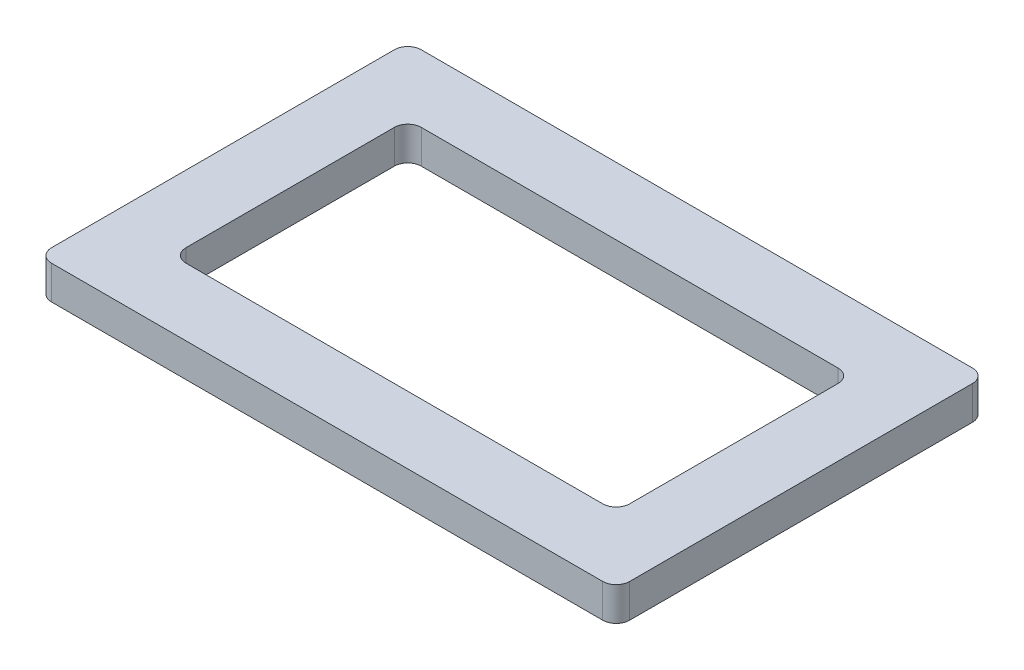
ISO-10303-21;
HEADER;
FILE_DESCRIPTION(('STEP AP214'),'2;1');
FILE_NAME('part.step','',(''),(''),'','','');
FILE_SCHEMA(('AUTOMOTIVE_DESIGN { 1 0 10303 214 1 1 1 1 }'));
ENDSEC;
DATA;
#1=APPLICATION_CONTEXT('core data for automotive mechanical design processes');
#2=APPLICATION_PROTOCOL_DEFINITION('international standard','automotive_design',2000,#1);
#3=PRODUCT_CONTEXT('',#1,'mechanical');
#4=PRODUCT('Part','Part','',(#3));
#5=PRODUCT_RELATED_PRODUCT_CATEGORY('part','',(#4));
#6=PRODUCT_DEFINITION_FORMATION('','',#4);
#7=PRODUCT_DEFINITION_CONTEXT('part definition',#1,'design');
#8=PRODUCT_DEFINITION('design','',#6,#7);
#9=PRODUCT_DEFINITION_SHAPE('','',#8);
#10=(LENGTH_UNIT() NAMED_UNIT(*) SI_UNIT(.MILLI.,.METRE.));
#11=(NAMED_UNIT(*) PLANE_ANGLE_UNIT() SI_UNIT($,.RADIAN.));
#12=(NAMED_UNIT(*) SI_UNIT($,.STERADIAN.) SOLID_ANGLE_UNIT());
#13=UNCERTAINTY_MEASURE_WITH_UNIT(LENGTH_MEASURE(1.E-05),#10,'distance_accuracy_value','');
#14=(GEOMETRIC_REPRESENTATION_CONTEXT(3) GLOBAL_UNCERTAINTY_ASSIGNED_CONTEXT((#13)) GLOBAL_UNIT_ASSIGNED_CONTEXT((#10,
#11,#12)) REPRESENTATION_CONTEXT('',''));
#15=CARTESIAN_POINT('',(0.,0.,0.));
#16=DIRECTION('',(0.,0.,1.));
#17=DIRECTION('',(1.,0.,0.));
#18=AXIS2_PLACEMENT_3D('',#15,#16,#17);
#19=CARTESIAN_POINT('',(43.,5.,27.5));
#20=DIRECTION('',(-1.,0.,0.));
#21=DIRECTION('',(0.,0.,1.));
#22=AXIS2_PLACEMENT_3D('',#19,#20,#21);
#23=PLANE('',#22);
#24=DIRECTION('',(0.,0.,-1.));
#25=VECTOR('',#24,1.);
#26=CARTESIAN_POINT('',(43.,0.,27.5));
#27=LINE('',#26,#25);
#28=CARTESIAN_POINT('',(43.,0.,25.5));
#29=VERTEX_POINT('',#28);
#30=CARTESIAN_POINT('',(43.,0.,-25.5));
#31=VERTEX_POINT('',#30);
#32=EDGE_CURVE('E197',#29,#31,#27,.T.);
#33=ORIENTED_EDGE('',*,*,#32,.T.);
#34=DIRECTION('',(0.,-1.,0.));
#35=VECTOR('',#34,1.);
#36=CARTESIAN_POINT('',(43.,5.,-25.5));
#37=LINE('',#36,#35);
#38=CARTESIAN_POINT('',(43.,5.,-25.5));
#39=VERTEX_POINT('',#38);
#40=EDGE_CURVE('E237',#31,#39,#37,.F.);
#41=ORIENTED_EDGE('',*,*,#40,.T.);
#42=DIRECTION('',(0.,0.,-1.));
#43=VECTOR('',#42,1.);
#44=CARTESIAN_POINT('',(43.,5.,27.5));
#45=LINE('',#44,#43);
#46=CARTESIAN_POINT('',(43.,5.,25.5));
#47=VERTEX_POINT('',#46);
#48=EDGE_CURVE('E186',#47,#39,#45,.T.);
#49=ORIENTED_EDGE('',*,*,#48,.F.);
#50=DIRECTION('',(0.,-1.,0.));
#51=VECTOR('',#50,1.);
#52=CARTESIAN_POINT('',(43.,5.,25.5));
#53=LINE('',#52,#51);
#54=EDGE_CURVE('E234',#47,#29,#53,.T.);
#55=ORIENTED_EDGE('',*,*,#54,.T.);
#56=EDGE_LOOP('',(#33,#41,#49,#55));
#57=FACE_BOUND('',#56,.T.);
#58=ADVANCED_FACE('F32',(#57),#23,.F.);
#59=CARTESIAN_POINT('',(-43.,5.,-27.5));
#60=DIRECTION('',(0.,0.,1.));
#61=DIRECTION('',(1.,0.,0.));
#62=AXIS2_PLACEMENT_3D('',#59,#60,#61);
#63=PLANE('',#62);
#64=DIRECTION('',(-1.,0.,0.));
#65=VECTOR('',#64,1.);
#66=CARTESIAN_POINT('',(-43.,5.,-27.5));
#67=LINE('',#66,#65);
#68=CARTESIAN_POINT('',(41.,5.,-27.5));
#69=VERTEX_POINT('',#68);
#70=CARTESIAN_POINT('',(-41.,5.,-27.5));
#71=VERTEX_POINT('',#70);
#72=EDGE_CURVE('E189',#69,#71,#67,.T.);
#73=ORIENTED_EDGE('',*,*,#72,.F.);
#74=DIRECTION('',(0.,-1.,0.));
#75=VECTOR('',#74,1.);
#76=CARTESIAN_POINT('',(41.,5.,-27.5));
#77=LINE('',#76,#75);
#78=CARTESIAN_POINT('',(41.,0.,-27.5));
#79=VERTEX_POINT('',#78);
#80=EDGE_CURVE('E223',#69,#79,#77,.T.);
#81=ORIENTED_EDGE('',*,*,#80,.T.);
#82=DIRECTION('',(-1.,0.,0.));
#83=VECTOR('',#82,1.);
#84=CARTESIAN_POINT('',(-43.,0.,-27.5));
#85=LINE('',#84,#83);
#86=CARTESIAN_POINT('',(-41.,0.,-27.5));
#87=VERTEX_POINT('',#86);
#88=EDGE_CURVE('E200',#79,#87,#85,.T.);
#89=ORIENTED_EDGE('',*,*,#88,.T.);
#90=DIRECTION('',(0.,-1.,0.));
#91=VECTOR('',#90,1.);
#92=CARTESIAN_POINT('',(-41.,5.,-27.5));
#93=LINE('',#92,#91);
#94=EDGE_CURVE('E221',#87,#71,#93,.F.);
#95=ORIENTED_EDGE('',*,*,#94,.T.);
#96=EDGE_LOOP('',(#73,#81,#89,#95));
#97=FACE_BOUND('',#96,.T.);
#98=ADVANCED_FACE('F300',(#97),#63,.F.);
#99=CARTESIAN_POINT('',(-43.,5.,27.5));
#100=DIRECTION('',(1.,0.,0.));
#101=DIRECTION('',(0.,0.,-1.));
#102=AXIS2_PLACEMENT_3D('',#99,#100,#101);
#103=PLANE('',#102);
#104=DIRECTION('',(0.,0.,1.));
#105=VECTOR('',#104,1.);
#106=CARTESIAN_POINT('',(-43.,5.,27.5));
#107=LINE('',#106,#105);
#108=CARTESIAN_POINT('',(-43.,5.,-25.5));
#109=VERTEX_POINT('',#108);
#110=CARTESIAN_POINT('',(-43.,5.,25.5));
#111=VERTEX_POINT('',#110);
#112=EDGE_CURVE('E193',#109,#111,#107,.T.);
#113=ORIENTED_EDGE('',*,*,#112,.F.);
#114=DIRECTION('',(0.,-1.,0.));
#115=VECTOR('',#114,1.);
#116=CARTESIAN_POINT('',(-43.,5.,-25.5));
#117=LINE('',#116,#115);
#118=CARTESIAN_POINT('',(-43.,0.,-25.5));
#119=VERTEX_POINT('',#118);
#120=EDGE_CURVE('E157',#109,#119,#117,.T.);
#121=ORIENTED_EDGE('',*,*,#120,.T.);
#122=DIRECTION('',(0.,0.,1.));
#123=VECTOR('',#122,1.);
#124=CARTESIAN_POINT('',(-43.,0.,27.5));
#125=LINE('',#124,#123);
#126=CARTESIAN_POINT('',(-43.,0.,25.5));
#127=VERTEX_POINT('',#126);
#128=EDGE_CURVE('E203',#119,#127,#125,.T.);
#129=ORIENTED_EDGE('',*,*,#128,.T.);
#130=DIRECTION('',(0.,-1.,0.));
#131=VECTOR('',#130,1.);
#132=CARTESIAN_POINT('',(-43.,5.,25.5));
#133=LINE('',#132,#131);
#134=EDGE_CURVE('E250',#127,#111,#133,.F.);
#135=ORIENTED_EDGE('',*,*,#134,.T.);
#136=EDGE_LOOP('',(#113,#121,#129,#135));
#137=FACE_BOUND('',#136,.T.);
#138=ADVANCED_FACE('F306',(#137),#103,.F.);
#139=CARTESIAN_POINT('',(-43.,5.,27.5));
#140=DIRECTION('',(0.,0.,-1.));
#141=DIRECTION('',(-1.,0.,0.));
#142=AXIS2_PLACEMENT_3D('',#139,#140,#141);
#143=PLANE('',#142);
#144=DIRECTION('',(1.,0.,0.));
#145=VECTOR('',#144,1.);
#146=CARTESIAN_POINT('',(-43.,0.,27.5));
#147=LINE('',#146,#145);
#148=CARTESIAN_POINT('',(-41.,0.,27.5));
#149=VERTEX_POINT('',#148);
#150=CARTESIAN_POINT('',(41.,0.,27.5));
#151=VERTEX_POINT('',#150);
#152=EDGE_CURVE('E190',#149,#151,#147,.T.);
#153=ORIENTED_EDGE('',*,*,#152,.T.);
#154=DIRECTION('',(0.,-1.,0.));
#155=VECTOR('',#154,1.);
#156=CARTESIAN_POINT('',(41.,5.,27.5));
#157=LINE('',#156,#155);
#158=CARTESIAN_POINT('',(41.,5.,27.5));
#159=VERTEX_POINT('',#158);
#160=EDGE_CURVE('E47',#151,#159,#157,.F.);
#161=ORIENTED_EDGE('',*,*,#160,.T.);
#162=DIRECTION('',(1.,0.,0.));
#163=VECTOR('',#162,1.);
#164=CARTESIAN_POINT('',(-43.,5.,27.5));
#165=LINE('',#164,#163);
#166=CARTESIAN_POINT('',(-41.,5.,27.5));
#167=VERTEX_POINT('',#166);
#168=EDGE_CURVE('E195',#167,#159,#165,.T.);
#169=ORIENTED_EDGE('',*,*,#168,.F.);
#170=DIRECTION('',(0.,-1.,0.));
#171=VECTOR('',#170,1.);
#172=CARTESIAN_POINT('',(-41.,5.,27.5));
#173=LINE('',#172,#171);
#174=EDGE_CURVE('E246',#167,#149,#173,.T.);
#175=ORIENTED_EDGE('',*,*,#174,.T.);
#176=EDGE_LOOP('',(#153,#161,#169,#175));
#177=FACE_BOUND('',#176,.T.);
#178=ADVANCED_FACE('F312',(#177),#143,.F.);
#179=CARTESIAN_POINT('',(0.,5.,0.));
#180=DIRECTION('',(0.,-1.,0.));
#181=DIRECTION('',(0.,0.,-1.));
#182=AXIS2_PLACEMENT_3D('',#179,#180,#181);
#183=PLANE('',#182);
#184=DIRECTION('',(-1.,0.,0.));
#185=VECTOR('',#184,1.);
#186=CARTESIAN_POINT('',(-33.,5.,-17.5));
#187=LINE('',#186,#185);
#188=CARTESIAN_POINT('',(31.,5.,-17.5));
#189=VERTEX_POINT('',#188);
#190=CARTESIAN_POINT('',(-31.,5.,-17.5));
#191=VERTEX_POINT('',#190);
#192=EDGE_CURVE('E173',#189,#191,#187,.T.);
#193=ORIENTED_EDGE('',*,*,#192,.F.);
#194=CARTESIAN_POINT('',(31.,5.,-15.5));
#195=DIRECTION('',(0.,-1.,0.));
#196=DIRECTION('',(0.,0.,-1.));
#197=AXIS2_PLACEMENT_3D('',#194,#195,#196);
#198=CIRCLE('',#197,2.);
#199=CARTESIAN_POINT('',(33.,5.,-15.5));
#200=VERTEX_POINT('',#199);
#201=EDGE_CURVE('E172',#189,#200,#198,.T.);
#202=ORIENTED_EDGE('',*,*,#201,.T.);
#203=DIRECTION('',(0.,0.,-1.));
#204=VECTOR('',#203,1.);
#205=CARTESIAN_POINT('',(33.,5.,17.5));
#206=LINE('',#205,#204);
#207=CARTESIAN_POINT('',(33.,5.,15.5));
#208=VERTEX_POINT('',#207);
#209=EDGE_CURVE('E163',#208,#200,#206,.T.);
#210=ORIENTED_EDGE('',*,*,#209,.F.);
#211=CARTESIAN_POINT('',(31.,5.,15.5));
#212=DIRECTION('',(0.,-1.,0.));
#213=DIRECTION('',(0.,0.,-1.));
#214=AXIS2_PLACEMENT_3D('',#211,#212,#213);
#215=CIRCLE('',#214,2.);
#216=CARTESIAN_POINT('',(31.,5.,17.5));
#217=VERTEX_POINT('',#216);
#218=EDGE_CURVE('E146',#208,#217,#215,.T.);
#219=ORIENTED_EDGE('',*,*,#218,.T.);
#220=DIRECTION('',(1.,0.,0.));
#221=VECTOR('',#220,1.);
#222=CARTESIAN_POINT('',(-33.,5.,17.5));
#223=LINE('',#222,#221);
#224=CARTESIAN_POINT('',(-31.,5.,17.5));
#225=VERTEX_POINT('',#224);
#226=EDGE_CURVE('E184',#225,#217,#223,.T.);
#227=ORIENTED_EDGE('',*,*,#226,.F.);
#228=CARTESIAN_POINT('',(-31.,5.,15.5));
#229=DIRECTION('',(0.,-1.,0.));
#230=DIRECTION('',(0.,0.,-1.));
#231=AXIS2_PLACEMENT_3D('',#228,#229,#230);
#232=CIRCLE('',#231,2.);
#233=CARTESIAN_POINT('',(-33.,5.,15.5));
#234=VERTEX_POINT('',#233);
#235=EDGE_CURVE('E258',#225,#234,#232,.T.);
#236=ORIENTED_EDGE('',*,*,#235,.T.);
#237=DIRECTION('',(0.,0.,1.));
#238=VECTOR('',#237,1.);
#239=CARTESIAN_POINT('',(-33.,5.,17.5));
#240=LINE('',#239,#238);
#241=CARTESIAN_POINT('',(-33.,5.,-15.5));
#242=VERTEX_POINT('',#241);
#243=EDGE_CURVE('E176',#242,#234,#240,.T.);
#244=ORIENTED_EDGE('',*,*,#243,.F.);
#245=CARTESIAN_POINT('',(-31.,5.,-15.5));
#246=DIRECTION('',(0.,-1.,0.));
#247=DIRECTION('',(0.,0.,-1.));
#248=AXIS2_PLACEMENT_3D('',#245,#246,#247);
#249=CIRCLE('',#248,2.);
#250=EDGE_CURVE('E40',#242,#191,#249,.T.);
#251=ORIENTED_EDGE('',*,*,#250,.T.);
#252=EDGE_LOOP('',(#193,#202,#210,#219,#227,#236,#244,#251));
#253=FACE_BOUND('',#252,.T.);
#254=ORIENTED_EDGE('',*,*,#48,.T.);
#255=CARTESIAN_POINT('',(41.,5.,-25.5));
#256=DIRECTION('',(0.,-1.,0.));
#257=DIRECTION('',(0.,0.,-1.));
#258=AXIS2_PLACEMENT_3D('',#255,#256,#257);
#259=CIRCLE('',#258,2.);
#260=EDGE_CURVE('E244',#39,#69,#259,.F.);
#261=ORIENTED_EDGE('',*,*,#260,.T.);
#262=ORIENTED_EDGE('',*,*,#72,.T.);
#263=CARTESIAN_POINT('',(-41.,5.,-25.5));
#264=DIRECTION('',(0.,-1.,0.));
#265=DIRECTION('',(0.,0.,-1.));
#266=AXIS2_PLACEMENT_3D('',#263,#264,#265);
#267=CIRCLE('',#266,2.);
#268=EDGE_CURVE('E240',#71,#109,#267,.F.);
#269=ORIENTED_EDGE('',*,*,#268,.T.);
#270=ORIENTED_EDGE('',*,*,#112,.T.);
#271=CARTESIAN_POINT('',(-41.,5.,25.5));
#272=DIRECTION('',(0.,-1.,0.));
#273=DIRECTION('',(0.,0.,-1.));
#274=AXIS2_PLACEMENT_3D('',#271,#272,#273);
#275=CIRCLE('',#274,2.);
#276=EDGE_CURVE('E54',#111,#167,#275,.F.);
#277=ORIENTED_EDGE('',*,*,#276,.T.);
#278=ORIENTED_EDGE('',*,*,#168,.T.);
#279=CARTESIAN_POINT('',(41.,5.,25.5));
#280=DIRECTION('',(0.,-1.,0.));
#281=DIRECTION('',(0.,0.,-1.));
#282=AXIS2_PLACEMENT_3D('',#279,#280,#281);
#283=CIRCLE('',#282,2.);
#284=EDGE_CURVE('E242',#159,#47,#283,.F.);
#285=ORIENTED_EDGE('',*,*,#284,.T.);
#286=EDGE_LOOP('',(#254,#261,#262,#269,#270,#277,#278,#285));
#287=FACE_BOUND('',#286,.T.);
#288=ADVANCED_FACE('F171',(#253,#287),#183,.F.);
#289=CARTESIAN_POINT('',(0.,0.,0.));
#290=DIRECTION('',(0.,-1.,0.));
#291=DIRECTION('',(0.,0.,-1.));
#292=AXIS2_PLACEMENT_3D('',#289,#290,#291);
#293=PLANE('',#292);
#294=DIRECTION('',(1.,0.,0.));
#295=VECTOR('',#294,1.);
#296=CARTESIAN_POINT('',(-33.,0.,17.5));
#297=LINE('',#296,#295);
#298=CARTESIAN_POINT('',(-31.,0.,17.5));
#299=VERTEX_POINT('',#298);
#300=CARTESIAN_POINT('',(31.,0.,17.5));
#301=VERTEX_POINT('',#300);
#302=EDGE_CURVE('E179',#299,#301,#297,.T.);
#303=ORIENTED_EDGE('',*,*,#302,.T.);
#304=CARTESIAN_POINT('',(31.,0.,15.5));
#305=DIRECTION('',(0.,-1.,0.));
#306=DIRECTION('',(0.,0.,-1.));
#307=AXIS2_PLACEMENT_3D('',#304,#305,#306);
#308=CIRCLE('',#307,2.);
#309=CARTESIAN_POINT('',(33.,0.,15.5));
#310=VERTEX_POINT('',#309);
#311=EDGE_CURVE('E156',#301,#310,#308,.F.);
#312=ORIENTED_EDGE('',*,*,#311,.T.);
#313=DIRECTION('',(0.,0.,-1.));
#314=VECTOR('',#313,1.);
#315=CARTESIAN_POINT('',(33.,0.,17.5));
#316=LINE('',#315,#314);
#317=CARTESIAN_POINT('',(33.,0.,-15.5));
#318=VERTEX_POINT('',#317);
#319=EDGE_CURVE('E166',#310,#318,#316,.T.);
#320=ORIENTED_EDGE('',*,*,#319,.T.);
#321=CARTESIAN_POINT('',(31.,0.,-15.5));
#322=DIRECTION('',(0.,-1.,0.));
#323=DIRECTION('',(0.,0.,-1.));
#324=AXIS2_PLACEMENT_3D('',#321,#322,#323);
#325=CIRCLE('',#324,2.);
#326=CARTESIAN_POINT('',(31.,0.,-17.5));
#327=VERTEX_POINT('',#326);
#328=EDGE_CURVE('E256',#318,#327,#325,.F.);
#329=ORIENTED_EDGE('',*,*,#328,.T.);
#330=DIRECTION('',(-1.,0.,0.));
#331=VECTOR('',#330,1.);
#332=CARTESIAN_POINT('',(-33.,0.,-17.5));
#333=LINE('',#332,#331);
#334=CARTESIAN_POINT('',(-31.,0.,-17.5));
#335=VERTEX_POINT('',#334);
#336=EDGE_CURVE('E280',#327,#335,#333,.T.);
#337=ORIENTED_EDGE('',*,*,#336,.T.);
#338=CARTESIAN_POINT('',(-31.,0.,-15.5));
#339=DIRECTION('',(0.,-1.,0.));
#340=DIRECTION('',(0.,0.,-1.));
#341=AXIS2_PLACEMENT_3D('',#338,#339,#340);
#342=CIRCLE('',#341,2.);
#343=CARTESIAN_POINT('',(-33.,0.,-15.5));
#344=VERTEX_POINT('',#343);
#345=EDGE_CURVE('E11',#335,#344,#342,.F.);
#346=ORIENTED_EDGE('',*,*,#345,.T.);
#347=DIRECTION('',(0.,0.,1.));
#348=VECTOR('',#347,1.);
#349=CARTESIAN_POINT('',(-33.,0.,17.5));
#350=LINE('',#349,#348);
#351=CARTESIAN_POINT('',(-33.,0.,15.5));
#352=VERTEX_POINT('',#351);
#353=EDGE_CURVE('E278',#344,#352,#350,.T.);
#354=ORIENTED_EDGE('',*,*,#353,.T.);
#355=CARTESIAN_POINT('',(-31.,0.,15.5));
#356=DIRECTION('',(0.,-1.,0.));
#357=DIRECTION('',(0.,0.,-1.));
#358=AXIS2_PLACEMENT_3D('',#355,#356,#357);
#359=CIRCLE('',#358,2.);
#360=EDGE_CURVE('E260',#352,#299,#359,.F.);
#361=ORIENTED_EDGE('',*,*,#360,.T.);
#362=EDGE_LOOP('',(#303,#312,#320,#329,#337,#346,#354,#361));
#363=FACE_BOUND('',#362,.T.);
#364=ORIENTED_EDGE('',*,*,#88,.F.);
#365=CARTESIAN_POINT('',(41.,0.,-25.5));
#366=DIRECTION('',(0.,-1.,0.));
#367=DIRECTION('',(0.,0.,-1.));
#368=AXIS2_PLACEMENT_3D('',#365,#366,#367);
#369=CIRCLE('',#368,2.);
#370=EDGE_CURVE('E232',#79,#31,#369,.T.);
#371=ORIENTED_EDGE('',*,*,#370,.T.);
#372=ORIENTED_EDGE('',*,*,#32,.F.);
#373=CARTESIAN_POINT('',(41.,0.,25.5));
#374=DIRECTION('',(0.,-1.,0.));
#375=DIRECTION('',(0.,0.,-1.));
#376=AXIS2_PLACEMENT_3D('',#373,#374,#375);
#377=CIRCLE('',#376,2.);
#378=EDGE_CURVE('E230',#29,#151,#377,.T.);
#379=ORIENTED_EDGE('',*,*,#378,.T.);
#380=ORIENTED_EDGE('',*,*,#152,.F.);
#381=CARTESIAN_POINT('',(-41.,0.,25.5));
#382=DIRECTION('',(0.,-1.,0.));
#383=DIRECTION('',(0.,0.,-1.));
#384=AXIS2_PLACEMENT_3D('',#381,#382,#383);
#385=CIRCLE('',#384,2.);
#386=EDGE_CURVE('E226',#149,#127,#385,.T.);
#387=ORIENTED_EDGE('',*,*,#386,.T.);
#388=ORIENTED_EDGE('',*,*,#128,.F.);
#389=CARTESIAN_POINT('',(-41.,0.,-25.5));
#390=DIRECTION('',(0.,-1.,0.));
#391=DIRECTION('',(0.,0.,-1.));
#392=AXIS2_PLACEMENT_3D('',#389,#390,#391);
#393=CIRCLE('',#392,2.);
#394=EDGE_CURVE('E228',#119,#87,#393,.T.);
#395=ORIENTED_EDGE('',*,*,#394,.T.);
#396=EDGE_LOOP('',(#364,#371,#372,#379,#380,#387,#388,#395));
#397=FACE_BOUND('',#396,.T.);
#398=ADVANCED_FACE('F276',(#363,#397),#293,.T.);
#399=CARTESIAN_POINT('',(33.,0.,17.5));
#400=DIRECTION('',(1.,0.,0.));
#401=DIRECTION('',(0.,0.,-1.));
#402=AXIS2_PLACEMENT_3D('',#399,#400,#401);
#403=PLANE('',#402);
#404=ORIENTED_EDGE('',*,*,#319,.F.);
#405=DIRECTION('',(0.,1.,0.));
#406=VECTOR('',#405,1.);
#407=CARTESIAN_POINT('',(33.,5.,15.5));
#408=LINE('',#407,#406);
#409=EDGE_CURVE('E150',#310,#208,#408,.T.);
#410=ORIENTED_EDGE('',*,*,#409,.T.);
#411=ORIENTED_EDGE('',*,*,#209,.T.);
#412=DIRECTION('',(0.,1.,0.));
#413=VECTOR('',#412,1.);
#414=CARTESIAN_POINT('',(33.,0.,-15.5));
#415=LINE('',#414,#413);
#416=EDGE_CURVE('E168',#200,#318,#415,.F.);
#417=ORIENTED_EDGE('',*,*,#416,.T.);
#418=EDGE_LOOP('',(#404,#410,#411,#417));
#419=FACE_BOUND('',#418,.T.);
#420=ADVANCED_FACE('F162',(#419),#403,.F.);
#421=CARTESIAN_POINT('',(-33.,0.,17.5));
#422=DIRECTION('',(0.,0.,1.));
#423=DIRECTION('',(1.,0.,0.));
#424=AXIS2_PLACEMENT_3D('',#421,#422,#423);
#425=PLANE('',#424);
#426=ORIENTED_EDGE('',*,*,#226,.T.);
#427=DIRECTION('',(0.,1.,0.));
#428=VECTOR('',#427,1.);
#429=CARTESIAN_POINT('',(31.,0.,17.5));
#430=LINE('',#429,#428);
#431=EDGE_CURVE('E151',#217,#301,#430,.F.);
#432=ORIENTED_EDGE('',*,*,#431,.T.);
#433=ORIENTED_EDGE('',*,*,#302,.F.);
#434=DIRECTION('',(0.,1.,0.));
#435=VECTOR('',#434,1.);
#436=CARTESIAN_POINT('',(-31.,5.,17.5));
#437=LINE('',#436,#435);
#438=EDGE_CURVE('E167',#299,#225,#437,.T.);
#439=ORIENTED_EDGE('',*,*,#438,.T.);
#440=EDGE_LOOP('',(#426,#432,#433,#439));
#441=FACE_BOUND('',#440,.T.);
#442=ADVANCED_FACE('F322',(#441),#425,.F.);
#443=CARTESIAN_POINT('',(-33.,0.,17.5));
#444=DIRECTION('',(-1.,0.,0.));
#445=DIRECTION('',(0.,0.,1.));
#446=AXIS2_PLACEMENT_3D('',#443,#444,#445);
#447=PLANE('',#446);
#448=ORIENTED_EDGE('',*,*,#243,.T.);
#449=DIRECTION('',(0.,1.,0.));
#450=VECTOR('',#449,1.);
#451=CARTESIAN_POINT('',(-33.,0.,15.5));
#452=LINE('',#451,#450);
#453=EDGE_CURVE('E219',#234,#352,#452,.F.);
#454=ORIENTED_EDGE('',*,*,#453,.T.);
#455=ORIENTED_EDGE('',*,*,#353,.F.);
#456=DIRECTION('',(0.,1.,0.));
#457=VECTOR('',#456,1.);
#458=CARTESIAN_POINT('',(-33.,5.,-15.5));
#459=LINE('',#458,#457);
#460=EDGE_CURVE('E216',#344,#242,#459,.T.);
#461=ORIENTED_EDGE('',*,*,#460,.T.);
#462=EDGE_LOOP('',(#448,#454,#455,#461));
#463=FACE_BOUND('',#462,.T.);
#464=ADVANCED_FACE('F282',(#463),#447,.F.);
#465=CARTESIAN_POINT('',(-33.,0.,-17.5));
#466=DIRECTION('',(0.,0.,-1.));
#467=DIRECTION('',(-1.,0.,0.));
#468=AXIS2_PLACEMENT_3D('',#465,#466,#467);
#469=PLANE('',#468);
#470=ORIENTED_EDGE('',*,*,#336,.F.);
#471=DIRECTION('',(0.,1.,0.));
#472=VECTOR('',#471,1.);
#473=CARTESIAN_POINT('',(31.,5.,-17.5));
#474=LINE('',#473,#472);
#475=EDGE_CURVE('E213',#327,#189,#474,.T.);
#476=ORIENTED_EDGE('',*,*,#475,.T.);
#477=ORIENTED_EDGE('',*,*,#192,.T.);
#478=DIRECTION('',(0.,1.,0.));
#479=VECTOR('',#478,1.);
#480=CARTESIAN_POINT('',(-31.,0.,-17.5));
#481=LINE('',#480,#479);
#482=EDGE_CURVE('E211',#191,#335,#481,.F.);
#483=ORIENTED_EDGE('',*,*,#482,.T.);
#484=EDGE_LOOP('',(#470,#476,#477,#483));
#485=FACE_BOUND('',#484,.T.);
#486=ADVANCED_FACE('F267',(#485),#469,.F.);
#487=CARTESIAN_POINT('',(31.,0.,15.5));
#488=DIRECTION('',(0.,-1.,0.));
#489=DIRECTION('',(0.,0.,-1.));
#490=AXIS2_PLACEMENT_3D('',#487,#488,#489);
#491=CYLINDRICAL_SURFACE('',#490,2.);
#492=ORIENTED_EDGE('',*,*,#311,.F.);
#493=ORIENTED_EDGE('',*,*,#431,.F.);
#494=ORIENTED_EDGE('',*,*,#218,.F.);
#495=ORIENTED_EDGE('',*,*,#409,.F.);
#496=EDGE_LOOP('',(#492,#493,#494,#495));
#497=FACE_BOUND('',#496,.T.);
#498=ADVANCED_FACE('F149',(#497),#491,.F.);
#499=CARTESIAN_POINT('',(31.,0.,-15.5));
#500=DIRECTION('',(0.,-1.,0.));
#501=DIRECTION('',(0.,0.,-1.));
#502=AXIS2_PLACEMENT_3D('',#499,#500,#501);
#503=CYLINDRICAL_SURFACE('',#502,2.);
#504=ORIENTED_EDGE('',*,*,#328,.F.);
#505=ORIENTED_EDGE('',*,*,#416,.F.);
#506=ORIENTED_EDGE('',*,*,#201,.F.);
#507=ORIENTED_EDGE('',*,*,#475,.F.);
#508=EDGE_LOOP('',(#504,#505,#506,#507));
#509=FACE_BOUND('',#508,.T.);
#510=ADVANCED_FACE('F288',(#509),#503,.F.);
#511=CARTESIAN_POINT('',(-31.,0.,15.5));
#512=DIRECTION('',(0.,-1.,0.));
#513=DIRECTION('',(0.,0.,-1.));
#514=AXIS2_PLACEMENT_3D('',#511,#512,#513);
#515=CYLINDRICAL_SURFACE('',#514,2.);
#516=ORIENTED_EDGE('',*,*,#360,.F.);
#517=ORIENTED_EDGE('',*,*,#453,.F.);
#518=ORIENTED_EDGE('',*,*,#235,.F.);
#519=ORIENTED_EDGE('',*,*,#438,.F.);
#520=EDGE_LOOP('',(#516,#517,#518,#519));
#521=FACE_BOUND('',#520,.T.);
#522=ADVANCED_FACE('F290',(#521),#515,.F.);
#523=CARTESIAN_POINT('',(-31.,0.,-15.5));
#524=DIRECTION('',(0.,-1.,0.));
#525=DIRECTION('',(0.,0.,-1.));
#526=AXIS2_PLACEMENT_3D('',#523,#524,#525);
#527=CYLINDRICAL_SURFACE('',#526,2.);
#528=ORIENTED_EDGE('',*,*,#345,.F.);
#529=ORIENTED_EDGE('',*,*,#482,.F.);
#530=ORIENTED_EDGE('',*,*,#250,.F.);
#531=ORIENTED_EDGE('',*,*,#460,.F.);
#532=EDGE_LOOP('',(#528,#529,#530,#531));
#533=FACE_BOUND('',#532,.T.);
#534=ADVANCED_FACE('F271',(#533),#527,.F.);
#535=CARTESIAN_POINT('',(41.,5.,-25.5));
#536=DIRECTION('',(0.,-1.,0.));
#537=DIRECTION('',(0.,0.,-1.));
#538=AXIS2_PLACEMENT_3D('',#535,#536,#537);
#539=CYLINDRICAL_SURFACE('',#538,2.);
#540=ORIENTED_EDGE('',*,*,#260,.F.);
#541=ORIENTED_EDGE('',*,*,#40,.F.);
#542=ORIENTED_EDGE('',*,*,#370,.F.);
#543=ORIENTED_EDGE('',*,*,#80,.F.);
#544=EDGE_LOOP('',(#540,#541,#542,#543));
#545=FACE_BOUND('',#544,.T.);
#546=ADVANCED_FACE('F366',(#545),#539,.T.);
#547=CARTESIAN_POINT('',(41.,5.,25.5));
#548=DIRECTION('',(0.,-1.,0.));
#549=DIRECTION('',(0.,0.,-1.));
#550=AXIS2_PLACEMENT_3D('',#547,#548,#549);
#551=CYLINDRICAL_SURFACE('',#550,2.);
#552=ORIENTED_EDGE('',*,*,#284,.F.);
#553=ORIENTED_EDGE('',*,*,#160,.F.);
#554=ORIENTED_EDGE('',*,*,#378,.F.);
#555=ORIENTED_EDGE('',*,*,#54,.F.);
#556=EDGE_LOOP('',(#552,#553,#554,#555));
#557=FACE_BOUND('',#556,.T.);
#558=ADVANCED_FACE('F375',(#557),#551,.T.);
#559=CARTESIAN_POINT('',(-41.,5.,-25.5));
#560=DIRECTION('',(0.,-1.,0.));
#561=DIRECTION('',(0.,0.,-1.));
#562=AXIS2_PLACEMENT_3D('',#559,#560,#561);
#563=CYLINDRICAL_SURFACE('',#562,2.);
#564=ORIENTED_EDGE('',*,*,#268,.F.);
#565=ORIENTED_EDGE('',*,*,#94,.F.);
#566=ORIENTED_EDGE('',*,*,#394,.F.);
#567=ORIENTED_EDGE('',*,*,#120,.F.);
#568=EDGE_LOOP('',(#564,#565,#566,#567));
#569=FACE_BOUND('',#568,.T.);
#570=ADVANCED_FACE('F385',(#569),#563,.T.);
#571=CARTESIAN_POINT('',(-41.,5.,25.5));
#572=DIRECTION('',(0.,-1.,0.));
#573=DIRECTION('',(0.,0.,-1.));
#574=AXIS2_PLACEMENT_3D('',#571,#572,#573);
#575=CYLINDRICAL_SURFACE('',#574,2.);
#576=ORIENTED_EDGE('',*,*,#276,.F.);
#577=ORIENTED_EDGE('',*,*,#134,.F.);
#578=ORIENTED_EDGE('',*,*,#386,.F.);
#579=ORIENTED_EDGE('',*,*,#174,.F.);
#580=EDGE_LOOP('',(#576,#577,#578,#579));
#581=FACE_BOUND('',#580,.T.);
#582=ADVANCED_FACE('F34',(#581),#575,.T.);
#583=CLOSED_SHELL('',(#58,#98,#138,#178,#288,#398,#420,#442,#464,#486,#498,#510,#522,#534,#546,
#558,#570,#582));
#584=MANIFOLD_SOLID_BREP('B2',#583);
#585=ADVANCED_BREP_SHAPE_REPRESENTATION('',(#18,#584),#14);
#586=SHAPE_DEFINITION_REPRESENTATION(#9,#585);
ENDSEC;
END-ISO-10303-21;
